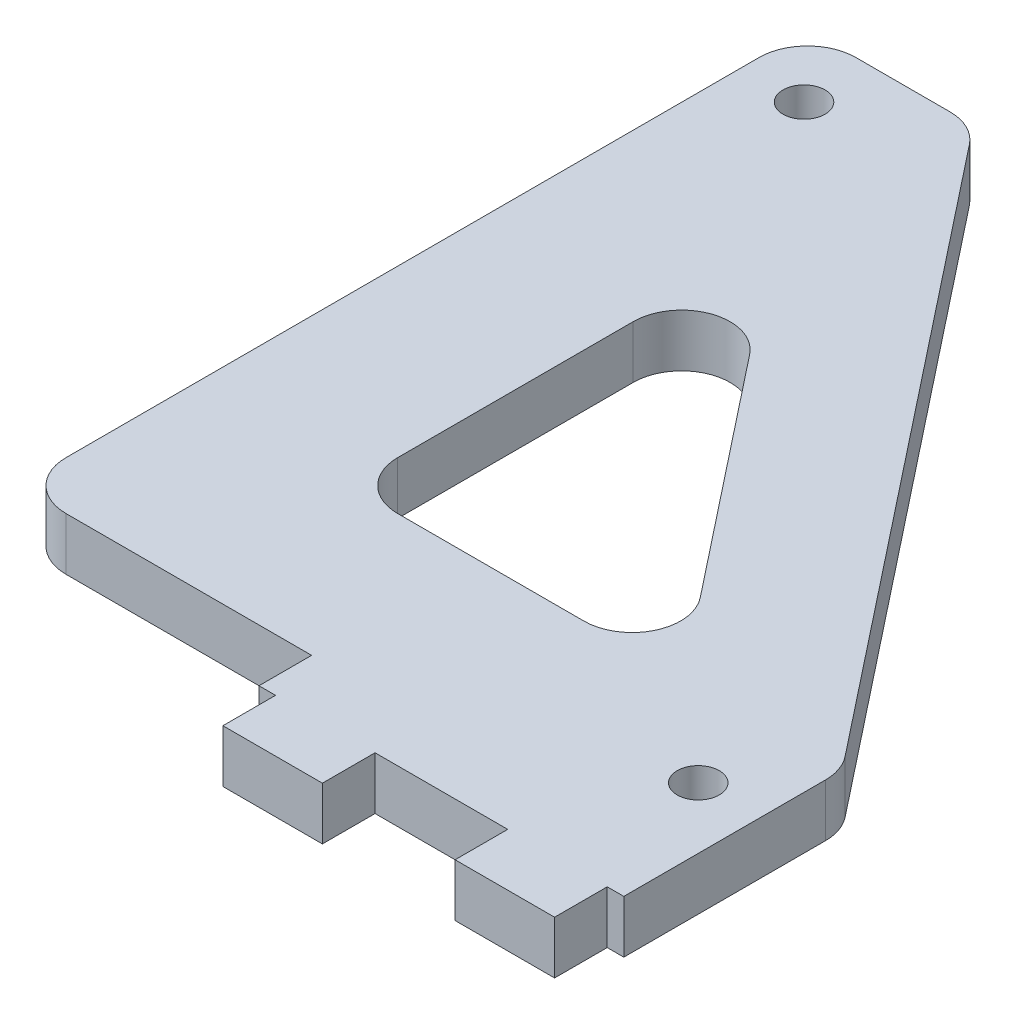
ISO-10303-21;
HEADER;
FILE_DESCRIPTION(('STEP AP214'),'2;1');
FILE_NAME('part.step','',(''),(''),'','','');
FILE_SCHEMA(('AUTOMOTIVE_DESIGN { 1 0 10303 214 1 1 1 1 }'));
ENDSEC;
DATA;
#1=APPLICATION_CONTEXT('core data for automotive mechanical design processes');
#2=APPLICATION_PROTOCOL_DEFINITION('international standard','automotive_design',2000,#1);
#3=PRODUCT_CONTEXT('',#1,'mechanical');
#4=PRODUCT('Part','Part','',(#3));
#5=PRODUCT_RELATED_PRODUCT_CATEGORY('part','',(#4));
#6=PRODUCT_DEFINITION_FORMATION('','',#4);
#7=PRODUCT_DEFINITION_CONTEXT('part definition',#1,'design');
#8=PRODUCT_DEFINITION('design','',#6,#7);
#9=PRODUCT_DEFINITION_SHAPE('','',#8);
#10=(LENGTH_UNIT() NAMED_UNIT(*) SI_UNIT(.MILLI.,.METRE.));
#11=(NAMED_UNIT(*) PLANE_ANGLE_UNIT() SI_UNIT($,.RADIAN.));
#12=(NAMED_UNIT(*) SI_UNIT($,.STERADIAN.) SOLID_ANGLE_UNIT());
#13=UNCERTAINTY_MEASURE_WITH_UNIT(LENGTH_MEASURE(1.E-05),#10,'distance_accuracy_value','');
#14=(GEOMETRIC_REPRESENTATION_CONTEXT(3) GLOBAL_UNCERTAINTY_ASSIGNED_CONTEXT((#13)) GLOBAL_UNIT_ASSIGNED_CONTEXT((#10,
#11,#12)) REPRESENTATION_CONTEXT('',''));
#15=CARTESIAN_POINT('',(0.,0.,0.));
#16=DIRECTION('',(0.,0.,1.));
#17=DIRECTION('',(1.,0.,0.));
#18=AXIS2_PLACEMENT_3D('',#15,#16,#17);
#19=CARTESIAN_POINT('',(0.,0.,3.175));
#20=DIRECTION('',(0.,0.,1.));
#21=DIRECTION('',(1.,0.,0.));
#22=AXIS2_PLACEMENT_3D('',#19,#20,#21);
#23=PLANE('',#22);
#24=DIRECTION('',(1.,0.,0.));
#25=VECTOR('',#24,1.);
#26=CARTESIAN_POINT('',(17.73,0.,3.175));
#27=LINE('',#26,#25);
#28=CARTESIAN_POINT('',(24.73,0.,3.175));
#29=VERTEX_POINT('',#28);
#30=CARTESIAN_POINT('',(32.73,0.,3.175));
#31=VERTEX_POINT('',#30);
#32=EDGE_CURVE('E223',#29,#31,#27,.T.);
#33=ORIENTED_EDGE('',*,*,#32,.T.);
#34=DIRECTION('',(0.,-1.,0.));
#35=VECTOR('',#34,1.);
#36=CARTESIAN_POINT('',(32.73,3.175,3.175));
#37=LINE('',#36,#35);
#38=CARTESIAN_POINT('',(32.73,3.175,3.175));
#39=VERTEX_POINT('',#38);
#40=EDGE_CURVE('E221',#39,#31,#37,.T.);
#41=ORIENTED_EDGE('',*,*,#40,.F.);
#42=DIRECTION('',(-1.,0.,0.));
#43=VECTOR('',#42,1.);
#44=CARTESIAN_POINT('',(17.73,3.175,3.175));
#45=LINE('',#44,#43);
#46=CARTESIAN_POINT('',(24.73,3.175,3.175));
#47=VERTEX_POINT('',#46);
#48=EDGE_CURVE('E204',#39,#47,#45,.T.);
#49=ORIENTED_EDGE('',*,*,#48,.T.);
#50=DIRECTION('',(0.,1.,0.));
#51=VECTOR('',#50,1.);
#52=CARTESIAN_POINT('',(24.73,3.175,3.175));
#53=LINE('',#52,#51);
#54=EDGE_CURVE('E251',#29,#47,#53,.T.);
#55=ORIENTED_EDGE('',*,*,#54,.F.);
#56=EDGE_LOOP('',(#33,#41,#49,#55));
#57=FACE_BOUND('',#56,.T.);
#58=ADVANCED_FACE('F39',(#57),#23,.T.);
#59=CARTESIAN_POINT('',(39.73,3.175,3.175));
#60=VERTEX_POINT('',#59);
#61=CARTESIAN_POINT('',(38.73,3.175,3.175));
#62=VERTEX_POINT('',#61);
#63=EDGE_CURVE('E54',#60,#62,#45,.T.);
#64=ORIENTED_EDGE('',*,*,#63,.T.);
#65=DIRECTION('',(0.,1.,0.));
#66=VECTOR('',#65,1.);
#67=CARTESIAN_POINT('',(38.73,3.175,3.175));
#68=LINE('',#67,#66);
#69=CARTESIAN_POINT('',(38.73,0.,3.175));
#70=VERTEX_POINT('',#69);
#71=EDGE_CURVE('E58',#70,#62,#68,.T.);
#72=ORIENTED_EDGE('',*,*,#71,.F.);
#73=CARTESIAN_POINT('',(39.73,0.,3.175));
#74=VERTEX_POINT('',#73);
#75=EDGE_CURVE('E274',#70,#74,#27,.T.);
#76=ORIENTED_EDGE('',*,*,#75,.T.);
#77=DIRECTION('',(0.,1.,0.));
#78=VECTOR('',#77,1.);
#79=CARTESIAN_POINT('',(39.73,3.175,3.175));
#80=LINE('',#79,#78);
#81=EDGE_CURVE('E277',#74,#60,#80,.T.);
#82=ORIENTED_EDGE('',*,*,#81,.T.);
#83=EDGE_LOOP('',(#64,#72,#76,#82));
#84=FACE_BOUND('',#83,.T.);
#85=ADVANCED_FACE('F445',(#84),#23,.T.);
#86=DIRECTION('',(0.,-1.,0.));
#87=VECTOR('',#86,1.);
#88=CARTESIAN_POINT('',(18.73,3.175,3.175));
#89=LINE('',#88,#87);
#90=CARTESIAN_POINT('',(18.73,3.175,3.175));
#91=VERTEX_POINT('',#90);
#92=CARTESIAN_POINT('',(18.73,0.,3.175));
#93=VERTEX_POINT('',#92);
#94=EDGE_CURVE('E227',#91,#93,#89,.T.);
#95=ORIENTED_EDGE('',*,*,#94,.F.);
#96=CARTESIAN_POINT('',(17.73,3.175,3.175));
#97=VERTEX_POINT('',#96);
#98=EDGE_CURVE('E218',#91,#97,#45,.T.);
#99=ORIENTED_EDGE('',*,*,#98,.T.);
#100=DIRECTION('',(0.,-1.,0.));
#101=VECTOR('',#100,1.);
#102=CARTESIAN_POINT('',(17.73,3.175,3.175));
#103=LINE('',#102,#101);
#104=CARTESIAN_POINT('',(17.73,0.,3.175));
#105=VERTEX_POINT('',#104);
#106=EDGE_CURVE('E271',#97,#105,#103,.T.);
#107=ORIENTED_EDGE('',*,*,#106,.T.);
#108=EDGE_CURVE('E275',#105,#93,#27,.T.);
#109=ORIENTED_EDGE('',*,*,#108,.T.);
#110=EDGE_LOOP('',(#95,#99,#107,#109));
#111=FACE_BOUND('',#110,.T.);
#112=ADVANCED_FACE('F447',(#111),#23,.T.);
#113=CARTESIAN_POINT('',(39.73,3.175,0.));
#114=DIRECTION('',(0.,0.,-1.));
#115=DIRECTION('',(-1.,0.,0.));
#116=AXIS2_PLACEMENT_3D('',#113,#114,#115);
#117=PLANE('',#116);
#118=DIRECTION('',(0.,-1.,0.));
#119=VECTOR('',#118,1.);
#120=CARTESIAN_POINT('',(17.73,3.175,0.));
#121=LINE('',#120,#119);
#122=CARTESIAN_POINT('',(17.73,3.175,0.));
#123=VERTEX_POINT('',#122);
#124=CARTESIAN_POINT('',(17.73,0.,0.));
#125=VERTEX_POINT('',#124);
#126=EDGE_CURVE('E270',#123,#125,#121,.T.);
#127=ORIENTED_EDGE('',*,*,#126,.F.);
#128=DIRECTION('',(1.,0.,0.));
#129=VECTOR('',#128,1.);
#130=CARTESIAN_POINT('',(39.73,3.175,0.));
#131=LINE('',#130,#129);
#132=CARTESIAN_POINT('',(2.921,3.175,0.));
#133=VERTEX_POINT('',#132);
#134=EDGE_CURVE('E316',#133,#123,#131,.T.);
#135=ORIENTED_EDGE('',*,*,#134,.F.);
#136=DIRECTION('',(0.,-1.,0.));
#137=VECTOR('',#136,1.);
#138=CARTESIAN_POINT('',(2.921,3.175,0.));
#139=LINE('',#138,#137);
#140=CARTESIAN_POINT('',(2.921,0.,0.));
#141=VERTEX_POINT('',#140);
#142=EDGE_CURVE('E392',#133,#141,#139,.T.);
#143=ORIENTED_EDGE('',*,*,#142,.T.);
#144=DIRECTION('',(1.,0.,0.));
#145=VECTOR('',#144,1.);
#146=CARTESIAN_POINT('',(39.73,0.,0.));
#147=LINE('',#146,#145);
#148=EDGE_CURVE('E308',#141,#125,#147,.T.);
#149=ORIENTED_EDGE('',*,*,#148,.T.);
#150=EDGE_LOOP('',(#127,#135,#143,#149));
#151=FACE_BOUND('',#150,.T.);
#152=ADVANCED_FACE('F454',(#151),#117,.F.);
#153=CARTESIAN_POINT('',(0.,3.175,0.));
#154=DIRECTION('',(0.,-1.,0.));
#155=DIRECTION('',(0.,0.,-1.));
#156=AXIS2_PLACEMENT_3D('',#153,#154,#155);
#157=PLANE('',#156);
#158=DIRECTION('',(-0.619928204493088,0.,-0.784658538011265));
#159=VECTOR('',#158,1.);
#160=CARTESIAN_POINT('',(10.,3.175,-47.63));
#161=LINE('',#160,#159);
#162=CARTESIAN_POINT('',(39.1009875895309,3.175,-10.7961566433216));
#163=VERTEX_POINT('',#162);
#164=CARTESIAN_POINT('',(10.8771177309941,3.175,-46.5198102853243));
#165=VERTEX_POINT('',#164);
#166=EDGE_CURVE('E323',#163,#165,#161,.T.);
#167=ORIENTED_EDGE('',*,*,#166,.T.);
#168=CARTESIAN_POINT('',(8.5851301414632,3.175,-44.709));
#169=DIRECTION('',(0.,-1.,0.));
#170=DIRECTION('',(0.,0.,-1.));
#171=AXIS2_PLACEMENT_3D('',#168,#169,#170);
#172=CIRCLE('',#171,2.921);
#173=CARTESIAN_POINT('',(8.5851301414632,3.175,-47.63));
#174=VERTEX_POINT('',#173);
#175=EDGE_CURVE('E368',#165,#174,#172,.F.);
#176=ORIENTED_EDGE('',*,*,#175,.T.);
#177=DIRECTION('',(-1.,0.,0.));
#178=VECTOR('',#177,1.);
#179=CARTESIAN_POINT('',(0.,3.175,-47.63));
#180=LINE('',#179,#178);
#181=CARTESIAN_POINT('',(2.921,3.175,-47.63));
#182=VERTEX_POINT('',#181);
#183=EDGE_CURVE('E325',#174,#182,#180,.T.);
#184=ORIENTED_EDGE('',*,*,#183,.T.);
#185=CARTESIAN_POINT('',(2.921,3.175,-44.709));
#186=DIRECTION('',(0.,-1.,0.));
#187=DIRECTION('',(0.,0.,-1.));
#188=AXIS2_PLACEMENT_3D('',#185,#186,#187);
#189=CIRCLE('',#188,2.921);
#190=CARTESIAN_POINT('',(0.,3.175,-44.709));
#191=VERTEX_POINT('',#190);
#192=EDGE_CURVE('E364',#182,#191,#189,.F.);
#193=ORIENTED_EDGE('',*,*,#192,.T.);
#194=DIRECTION('',(0.,0.,1.));
#195=VECTOR('',#194,1.);
#196=CARTESIAN_POINT('',(0.,3.175,0.));
#197=LINE('',#196,#195);
#198=CARTESIAN_POINT('',(0.,3.175,-2.921));
#199=VERTEX_POINT('',#198);
#200=EDGE_CURVE('E328',#191,#199,#197,.T.);
#201=ORIENTED_EDGE('',*,*,#200,.T.);
#202=CARTESIAN_POINT('',(2.921,3.175,-2.921));
#203=DIRECTION('',(0.,-1.,0.));
#204=DIRECTION('',(0.,0.,-1.));
#205=AXIS2_PLACEMENT_3D('',#202,#203,#204);
#206=CIRCLE('',#205,2.921);
#207=EDGE_CURVE('E362',#199,#133,#206,.F.);
#208=ORIENTED_EDGE('',*,*,#207,.T.);
#209=ORIENTED_EDGE('',*,*,#134,.T.);
#210=DIRECTION('',(0.,0.,-1.));
#211=VECTOR('',#210,1.);
#212=CARTESIAN_POINT('',(17.73,3.175,3.175));
#213=LINE('',#212,#211);
#214=EDGE_CURVE('E279',#97,#123,#213,.T.);
#215=ORIENTED_EDGE('',*,*,#214,.F.);
#216=ORIENTED_EDGE('',*,*,#98,.F.);
#217=DIRECTION('',(0.,0.,-1.));
#218=VECTOR('',#217,1.);
#219=CARTESIAN_POINT('',(18.73,3.175,6.35));
#220=LINE('',#219,#218);
#221=CARTESIAN_POINT('',(18.73,3.175,6.35));
#222=VERTEX_POINT('',#221);
#223=EDGE_CURVE('E257',#222,#91,#220,.T.);
#224=ORIENTED_EDGE('',*,*,#223,.F.);
#225=DIRECTION('',(-1.,0.,0.));
#226=VECTOR('',#225,1.);
#227=CARTESIAN_POINT('',(18.73,3.175,6.35));
#228=LINE('',#227,#226);
#229=CARTESIAN_POINT('',(24.73,3.175,6.35));
#230=VERTEX_POINT('',#229);
#231=EDGE_CURVE('E255',#230,#222,#228,.T.);
#232=ORIENTED_EDGE('',*,*,#231,.F.);
#233=DIRECTION('',(0.,0.,-1.));
#234=VECTOR('',#233,1.);
#235=CARTESIAN_POINT('',(24.73,3.175,6.35));
#236=LINE('',#235,#234);
#237=EDGE_CURVE('E215',#230,#47,#236,.T.);
#238=ORIENTED_EDGE('',*,*,#237,.T.);
#239=ORIENTED_EDGE('',*,*,#48,.F.);
#240=DIRECTION('',(0.,0.,-1.));
#241=VECTOR('',#240,1.);
#242=CARTESIAN_POINT('',(32.73,3.175,6.35));
#243=LINE('',#242,#241);
#244=CARTESIAN_POINT('',(32.73,3.175,6.35));
#245=VERTEX_POINT('',#244);
#246=EDGE_CURVE('E211',#245,#39,#243,.T.);
#247=ORIENTED_EDGE('',*,*,#246,.F.);
#248=DIRECTION('',(-1.,0.,0.));
#249=VECTOR('',#248,1.);
#250=CARTESIAN_POINT('',(32.73,3.175,6.35));
#251=LINE('',#250,#249);
#252=CARTESIAN_POINT('',(38.73,3.175,6.35));
#253=VERTEX_POINT('',#252);
#254=EDGE_CURVE('E232',#253,#245,#251,.T.);
#255=ORIENTED_EDGE('',*,*,#254,.F.);
#256=DIRECTION('',(0.,0.,-1.));
#257=VECTOR('',#256,1.);
#258=CARTESIAN_POINT('',(38.73,3.175,6.35));
#259=LINE('',#258,#257);
#260=EDGE_CURVE('E233',#253,#62,#259,.T.);
#261=ORIENTED_EDGE('',*,*,#260,.T.);
#262=ORIENTED_EDGE('',*,*,#63,.F.);
#263=DIRECTION('',(0.,0.,-1.));
#264=VECTOR('',#263,1.);
#265=CARTESIAN_POINT('',(39.73,3.175,-10.));
#266=LINE('',#265,#264);
#267=CARTESIAN_POINT('',(39.73,3.175,-8.98534635799732));
#268=VERTEX_POINT('',#267);
#269=EDGE_CURVE('E319',#60,#268,#266,.T.);
#270=ORIENTED_EDGE('',*,*,#269,.T.);
#271=CARTESIAN_POINT('',(36.809,3.175,-8.98534635799732));
#272=DIRECTION('',(0.,-1.,0.));
#273=DIRECTION('',(0.,0.,-1.));
#274=AXIS2_PLACEMENT_3D('',#271,#272,#273);
#275=CIRCLE('',#274,2.921);
#276=EDGE_CURVE('E366',#268,#163,#275,.F.);
#277=ORIENTED_EDGE('',*,*,#276,.T.);
#278=EDGE_LOOP('',(#167,#176,#184,#193,#201,#208,#209,#215,#216,#224,#232,#238,#239,#247,#255,
#261,#262,#270,#277));
#279=FACE_BOUND('',#278,.T.);
#280=DIRECTION('',(1.,0.,0.));
#281=VECTOR('',#280,1.);
#282=CARTESIAN_POINT('',(10.,3.175,-10.));
#283=LINE('',#282,#281);
#284=CARTESIAN_POINT('',(12.921,3.175,-10.));
#285=VERTEX_POINT('',#284);
#286=CARTESIAN_POINT('',(24.1412952414612,3.175,-10.));
#287=VERTEX_POINT('',#286);
#288=EDGE_CURVE('E298',#285,#287,#283,.T.);
#289=ORIENTED_EDGE('',*,*,#288,.F.);
#290=CARTESIAN_POINT('',(12.921,3.175,-12.921));
#291=DIRECTION('',(0.,-1.,0.));
#292=DIRECTION('',(0.,0.,-1.));
#293=AXIS2_PLACEMENT_3D('',#290,#291,#292);
#294=CIRCLE('',#293,2.921);
#295=CARTESIAN_POINT('',(10.,3.175,-12.921));
#296=VERTEX_POINT('',#295);
#297=EDGE_CURVE('E11',#285,#296,#294,.T.);
#298=ORIENTED_EDGE('',*,*,#297,.T.);
#299=DIRECTION('',(0.,0.,1.));
#300=VECTOR('',#299,1.);
#301=CARTESIAN_POINT('',(10.,3.175,-35.5318248473907));
#302=LINE('',#301,#300);
#303=CARTESIAN_POINT('',(10.,3.175,-27.1228065905208));
#304=VERTEX_POINT('',#303);
#305=EDGE_CURVE('E305',#304,#296,#302,.T.);
#306=ORIENTED_EDGE('',*,*,#305,.F.);
#307=CARTESIAN_POINT('',(12.921,3.175,-27.1228065905208));
#308=DIRECTION('',(0.,-1.,0.));
#309=DIRECTION('',(0.,0.,-1.));
#310=AXIS2_PLACEMENT_3D('',#307,#308,#309);
#311=CIRCLE('',#310,2.921);
#312=CARTESIAN_POINT('',(15.2129875895309,3.175,-28.9336168758451));
#313=VERTEX_POINT('',#312);
#314=EDGE_CURVE('E397',#304,#313,#311,.T.);
#315=ORIENTED_EDGE('',*,*,#314,.T.);
#316=DIRECTION('',(-0.619928204493088,0.,-0.784658538011265));
#317=VECTOR('',#316,1.);
#318=CARTESIAN_POINT('',(10.,3.175,-35.5318248473907));
#319=LINE('',#318,#317);
#320=CARTESIAN_POINT('',(26.4332828309921,3.175,-14.7318102853243));
#321=VERTEX_POINT('',#320);
#322=EDGE_CURVE('E301',#321,#313,#319,.T.);
#323=ORIENTED_EDGE('',*,*,#322,.F.);
#324=CARTESIAN_POINT('',(24.1412952414612,3.175,-12.921));
#325=DIRECTION('',(0.,-1.,0.));
#326=DIRECTION('',(0.,0.,-1.));
#327=AXIS2_PLACEMENT_3D('',#324,#325,#326);
#328=CIRCLE('',#327,2.921);
#329=EDGE_CURVE('E401',#321,#287,#328,.T.);
#330=ORIENTED_EDGE('',*,*,#329,.T.);
#331=EDGE_LOOP('',(#289,#298,#306,#315,#323,#330));
#332=FACE_BOUND('',#331,.T.);
#333=CARTESIAN_POINT('',(3.68299999999999,3.175,-43.74));
#334=DIRECTION('',(0.,1.,0.));
#335=DIRECTION('',(0.,0.,1.));
#336=AXIS2_PLACEMENT_3D('',#333,#334,#335);
#337=CIRCLE('',#336,1.27);
#338=CARTESIAN_POINT('',(3.68299999999999,3.175,-42.47));
#339=VERTEX_POINT('',#338);
#340=EDGE_CURVE('E292',#339,#339,#337,.T.);
#341=ORIENTED_EDGE('',*,*,#340,.F.);
#342=EDGE_LOOP('',(#341));
#343=FACE_BOUND('',#342,.T.);
#344=CARTESIAN_POINT('',(36.043,3.175,-5.));
#345=DIRECTION('',(0.,1.,0.));
#346=DIRECTION('',(0.,0.,1.));
#347=AXIS2_PLACEMENT_3D('',#344,#345,#346);
#348=CIRCLE('',#347,1.27);
#349=CARTESIAN_POINT('',(36.043,3.175,-3.73));
#350=VERTEX_POINT('',#349);
#351=EDGE_CURVE('E286',#350,#350,#348,.T.);
#352=ORIENTED_EDGE('',*,*,#351,.F.);
#353=EDGE_LOOP('',(#352));
#354=FACE_BOUND('',#353,.T.);
#355=ADVANCED_FACE('F207',(#279,#332,#343,#354),#157,.F.);
#356=CARTESIAN_POINT('',(0.,0.,0.));
#357=DIRECTION('',(0.,-1.,0.));
#358=DIRECTION('',(0.,0.,-1.));
#359=AXIS2_PLACEMENT_3D('',#356,#357,#358);
#360=PLANE('',#359);
#361=CARTESIAN_POINT('',(3.68299999999999,0.,-43.74));
#362=DIRECTION('',(0.,1.,0.));
#363=DIRECTION('',(0.,0.,1.));
#364=AXIS2_PLACEMENT_3D('',#361,#362,#363);
#365=CIRCLE('',#364,1.27);
#366=CARTESIAN_POINT('',(3.68299999999999,0.,-42.47));
#367=VERTEX_POINT('',#366);
#368=EDGE_CURVE('E289',#367,#367,#365,.T.);
#369=ORIENTED_EDGE('',*,*,#368,.T.);
#370=EDGE_LOOP('',(#369));
#371=FACE_BOUND('',#370,.T.);
#372=DIRECTION('',(-1.,0.,0.));
#373=VECTOR('',#372,1.);
#374=CARTESIAN_POINT('',(0.,0.,-47.63));
#375=LINE('',#374,#373);
#376=CARTESIAN_POINT('',(8.5851301414632,0.,-47.63));
#377=VERTEX_POINT('',#376);
#378=CARTESIAN_POINT('',(2.921,0.,-47.63));
#379=VERTEX_POINT('',#378);
#380=EDGE_CURVE('E340',#377,#379,#375,.T.);
#381=ORIENTED_EDGE('',*,*,#380,.F.);
#382=CARTESIAN_POINT('',(8.5851301414632,0.,-44.709));
#383=DIRECTION('',(0.,-1.,0.));
#384=DIRECTION('',(0.,0.,-1.));
#385=AXIS2_PLACEMENT_3D('',#382,#383,#384);
#386=CIRCLE('',#385,2.921);
#387=CARTESIAN_POINT('',(10.8771177309941,0.,-46.5198102853243));
#388=VERTEX_POINT('',#387);
#389=EDGE_CURVE('E355',#377,#388,#386,.T.);
#390=ORIENTED_EDGE('',*,*,#389,.T.);
#391=DIRECTION('',(-0.619928204493088,0.,-0.784658538011265));
#392=VECTOR('',#391,1.);
#393=CARTESIAN_POINT('',(10.,0.,-47.63));
#394=LINE('',#393,#392);
#395=CARTESIAN_POINT('',(39.1009875895309,0.,-10.7961566433216));
#396=VERTEX_POINT('',#395);
#397=EDGE_CURVE('E337',#396,#388,#394,.T.);
#398=ORIENTED_EDGE('',*,*,#397,.F.);
#399=CARTESIAN_POINT('',(36.809,0.,-8.98534635799732));
#400=DIRECTION('',(0.,-1.,0.));
#401=DIRECTION('',(0.,0.,-1.));
#402=AXIS2_PLACEMENT_3D('',#399,#400,#401);
#403=CIRCLE('',#402,2.921);
#404=CARTESIAN_POINT('',(39.73,0.,-8.98534635799732));
#405=VERTEX_POINT('',#404);
#406=EDGE_CURVE('E353',#396,#405,#403,.T.);
#407=ORIENTED_EDGE('',*,*,#406,.T.);
#408=DIRECTION('',(0.,0.,-1.));
#409=VECTOR('',#408,1.);
#410=CARTESIAN_POINT('',(39.73,0.,-10.));
#411=LINE('',#410,#409);
#412=EDGE_CURVE('E334',#74,#405,#411,.T.);
#413=ORIENTED_EDGE('',*,*,#412,.F.);
#414=ORIENTED_EDGE('',*,*,#75,.F.);
#415=DIRECTION('',(0.,0.,-1.));
#416=VECTOR('',#415,1.);
#417=CARTESIAN_POINT('',(38.73,0.,6.35));
#418=LINE('',#417,#416);
#419=CARTESIAN_POINT('',(38.73,0.,6.35));
#420=VERTEX_POINT('',#419);
#421=EDGE_CURVE('E238',#420,#70,#418,.T.);
#422=ORIENTED_EDGE('',*,*,#421,.F.);
#423=DIRECTION('',(1.,0.,0.));
#424=VECTOR('',#423,1.);
#425=CARTESIAN_POINT('',(32.73,0.,6.35));
#426=LINE('',#425,#424);
#427=CARTESIAN_POINT('',(32.73,0.,6.35));
#428=VERTEX_POINT('',#427);
#429=EDGE_CURVE('E244',#428,#420,#426,.T.);
#430=ORIENTED_EDGE('',*,*,#429,.F.);
#431=DIRECTION('',(0.,0.,-1.));
#432=VECTOR('',#431,1.);
#433=CARTESIAN_POINT('',(32.73,0.,6.35));
#434=LINE('',#433,#432);
#435=EDGE_CURVE('E477',#428,#31,#434,.T.);
#436=ORIENTED_EDGE('',*,*,#435,.T.);
#437=ORIENTED_EDGE('',*,*,#32,.F.);
#438=DIRECTION('',(0.,0.,-1.));
#439=VECTOR('',#438,1.);
#440=CARTESIAN_POINT('',(24.73,0.,6.35));
#441=LINE('',#440,#439);
#442=CARTESIAN_POINT('',(24.73,0.,6.35));
#443=VERTEX_POINT('',#442);
#444=EDGE_CURVE('E264',#443,#29,#441,.T.);
#445=ORIENTED_EDGE('',*,*,#444,.F.);
#446=DIRECTION('',(1.,0.,0.));
#447=VECTOR('',#446,1.);
#448=CARTESIAN_POINT('',(18.73,0.,6.35));
#449=LINE('',#448,#447);
#450=CARTESIAN_POINT('',(18.73,0.,6.35));
#451=VERTEX_POINT('',#450);
#452=EDGE_CURVE('E250',#451,#443,#449,.T.);
#453=ORIENTED_EDGE('',*,*,#452,.F.);
#454=DIRECTION('',(0.,0.,-1.));
#455=VECTOR('',#454,1.);
#456=CARTESIAN_POINT('',(18.73,0.,6.35));
#457=LINE('',#456,#455);
#458=EDGE_CURVE('E267',#451,#93,#457,.T.);
#459=ORIENTED_EDGE('',*,*,#458,.T.);
#460=ORIENTED_EDGE('',*,*,#108,.F.);
#461=DIRECTION('',(0.,0.,-1.));
#462=VECTOR('',#461,1.);
#463=CARTESIAN_POINT('',(17.73,0.,3.175));
#464=LINE('',#463,#462);
#465=EDGE_CURVE('E283',#105,#125,#464,.T.);
#466=ORIENTED_EDGE('',*,*,#465,.T.);
#467=ORIENTED_EDGE('',*,*,#148,.F.);
#468=CARTESIAN_POINT('',(2.921,0.,-2.921));
#469=DIRECTION('',(0.,-1.,0.));
#470=DIRECTION('',(0.,0.,-1.));
#471=AXIS2_PLACEMENT_3D('',#468,#469,#470);
#472=CIRCLE('',#471,2.921);
#473=CARTESIAN_POINT('',(0.,0.,-2.921));
#474=VERTEX_POINT('',#473);
#475=EDGE_CURVE('E349',#141,#474,#472,.T.);
#476=ORIENTED_EDGE('',*,*,#475,.T.);
#477=DIRECTION('',(0.,0.,1.));
#478=VECTOR('',#477,1.);
#479=CARTESIAN_POINT('',(0.,0.,0.));
#480=LINE('',#479,#478);
#481=CARTESIAN_POINT('',(0.,0.,-44.709));
#482=VERTEX_POINT('',#481);
#483=EDGE_CURVE('E320',#482,#474,#480,.T.);
#484=ORIENTED_EDGE('',*,*,#483,.F.);
#485=CARTESIAN_POINT('',(2.921,0.,-44.709));
#486=DIRECTION('',(0.,-1.,0.));
#487=DIRECTION('',(0.,0.,-1.));
#488=AXIS2_PLACEMENT_3D('',#485,#486,#487);
#489=CIRCLE('',#488,2.921);
#490=EDGE_CURVE('E351',#482,#379,#489,.T.);
#491=ORIENTED_EDGE('',*,*,#490,.T.);
#492=EDGE_LOOP('',(#381,#390,#398,#407,#413,#414,#422,#430,#436,#437,#445,#453,#459,#460,#466,
#467,#476,#484,#491));
#493=FACE_BOUND('',#492,.T.);
#494=DIRECTION('',(-0.619928204493088,0.,-0.784658538011265));
#495=VECTOR('',#494,1.);
#496=CARTESIAN_POINT('',(10.,0.,-35.5318248473907));
#497=LINE('',#496,#495);
#498=CARTESIAN_POINT('',(26.4332828309921,0.,-14.7318102853243));
#499=VERTEX_POINT('',#498);
#500=CARTESIAN_POINT('',(15.2129875895309,0.,-28.9336168758451));
#501=VERTEX_POINT('',#500);
#502=EDGE_CURVE('E311',#499,#501,#497,.T.);
#503=ORIENTED_EDGE('',*,*,#502,.T.);
#504=CARTESIAN_POINT('',(12.921,0.,-27.1228065905208));
#505=DIRECTION('',(0.,-1.,0.));
#506=DIRECTION('',(0.,0.,-1.));
#507=AXIS2_PLACEMENT_3D('',#504,#505,#506);
#508=CIRCLE('',#507,2.921);
#509=CARTESIAN_POINT('',(10.,0.,-27.1228065905208));
#510=VERTEX_POINT('',#509);
#511=EDGE_CURVE('E395',#501,#510,#508,.F.);
#512=ORIENTED_EDGE('',*,*,#511,.T.);
#513=DIRECTION('',(0.,0.,1.));
#514=VECTOR('',#513,1.);
#515=CARTESIAN_POINT('',(10.,0.,-35.5318248473907));
#516=LINE('',#515,#514);
#517=CARTESIAN_POINT('',(10.,0.,-12.921));
#518=VERTEX_POINT('',#517);
#519=EDGE_CURVE('E302',#510,#518,#516,.T.);
#520=ORIENTED_EDGE('',*,*,#519,.T.);
#521=CARTESIAN_POINT('',(12.921,0.,-12.921));
#522=DIRECTION('',(0.,-1.,0.));
#523=DIRECTION('',(0.,0.,-1.));
#524=AXIS2_PLACEMENT_3D('',#521,#522,#523);
#525=CIRCLE('',#524,2.921);
#526=CARTESIAN_POINT('',(12.921,0.,-10.));
#527=VERTEX_POINT('',#526);
#528=EDGE_CURVE('E47',#518,#527,#525,.F.);
#529=ORIENTED_EDGE('',*,*,#528,.T.);
#530=DIRECTION('',(1.,0.,0.));
#531=VECTOR('',#530,1.);
#532=CARTESIAN_POINT('',(10.,0.,-10.));
#533=LINE('',#532,#531);
#534=CARTESIAN_POINT('',(24.1412952414612,0.,-10.));
#535=VERTEX_POINT('',#534);
#536=EDGE_CURVE('E295',#527,#535,#533,.T.);
#537=ORIENTED_EDGE('',*,*,#536,.T.);
#538=CARTESIAN_POINT('',(24.1412952414612,0.,-12.921));
#539=DIRECTION('',(0.,-1.,0.));
#540=DIRECTION('',(0.,0.,-1.));
#541=AXIS2_PLACEMENT_3D('',#538,#539,#540);
#542=CIRCLE('',#541,2.921);
#543=EDGE_CURVE('E399',#535,#499,#542,.F.);
#544=ORIENTED_EDGE('',*,*,#543,.T.);
#545=EDGE_LOOP('',(#503,#512,#520,#529,#537,#544));
#546=FACE_BOUND('',#545,.T.);
#547=CARTESIAN_POINT('',(36.043,0.,-5.));
#548=DIRECTION('',(0.,1.,0.));
#549=DIRECTION('',(0.,0.,1.));
#550=AXIS2_PLACEMENT_3D('',#547,#548,#549);
#551=CIRCLE('',#550,1.27);
#552=CARTESIAN_POINT('',(36.043,0.,-3.73));
#553=VERTEX_POINT('',#552);
#554=EDGE_CURVE('E285',#553,#553,#551,.T.);
#555=ORIENTED_EDGE('',*,*,#554,.T.);
#556=EDGE_LOOP('',(#555));
#557=FACE_BOUND('',#556,.T.);
#558=ADVANCED_FACE('F404',(#371,#493,#546,#557),#360,.T.);
#559=CARTESIAN_POINT('',(39.73,3.175,-10.));
#560=DIRECTION('',(-1.,0.,0.));
#561=DIRECTION('',(0.,0.,1.));
#562=AXIS2_PLACEMENT_3D('',#559,#560,#561);
#563=PLANE('',#562);
#564=ORIENTED_EDGE('',*,*,#412,.T.);
#565=DIRECTION('',(0.,-1.,0.));
#566=VECTOR('',#565,1.);
#567=CARTESIAN_POINT('',(39.73,3.175,-8.98534635799732));
#568=LINE('',#567,#566);
#569=EDGE_CURVE('E370',#405,#268,#568,.F.);
#570=ORIENTED_EDGE('',*,*,#569,.T.);
#571=ORIENTED_EDGE('',*,*,#269,.F.);
#572=ORIENTED_EDGE('',*,*,#81,.F.);
#573=EDGE_LOOP('',(#564,#570,#571,#572));
#574=FACE_BOUND('',#573,.T.);
#575=ADVANCED_FACE('F485',(#574),#563,.F.);
#576=CARTESIAN_POINT('',(10.,3.175,-47.63));
#577=DIRECTION('',(-0.784658538011265,0.,0.619928204493088));
#578=DIRECTION('',(0.619928204493088,0.,0.784658538011265));
#579=AXIS2_PLACEMENT_3D('',#576,#577,#578);
#580=PLANE('',#579);
#581=ORIENTED_EDGE('',*,*,#397,.T.);
#582=DIRECTION('',(0.,-1.,0.));
#583=VECTOR('',#582,1.);
#584=CARTESIAN_POINT('',(10.8771177309941,3.175,-46.5198102853243));
#585=LINE('',#584,#583);
#586=EDGE_CURVE('E360',#388,#165,#585,.F.);
#587=ORIENTED_EDGE('',*,*,#586,.T.);
#588=ORIENTED_EDGE('',*,*,#166,.F.);
#589=DIRECTION('',(0.,-1.,0.));
#590=VECTOR('',#589,1.);
#591=CARTESIAN_POINT('',(39.1009875895309,3.175,-10.7961566433216));
#592=LINE('',#591,#590);
#593=EDGE_CURVE('E357',#163,#396,#592,.T.);
#594=ORIENTED_EDGE('',*,*,#593,.T.);
#595=EDGE_LOOP('',(#581,#587,#588,#594));
#596=FACE_BOUND('',#595,.T.);
#597=ADVANCED_FACE('F491',(#596),#580,.F.);
#598=CARTESIAN_POINT('',(0.,3.175,-47.63));
#599=DIRECTION('',(0.,0.,1.));
#600=DIRECTION('',(1.,0.,0.));
#601=AXIS2_PLACEMENT_3D('',#598,#599,#600);
#602=PLANE('',#601);
#603=ORIENTED_EDGE('',*,*,#183,.F.);
#604=DIRECTION('',(0.,-1.,0.));
#605=VECTOR('',#604,1.);
#606=CARTESIAN_POINT('',(8.5851301414632,3.175,-47.63));
#607=LINE('',#606,#605);
#608=EDGE_CURVE('E346',#174,#377,#607,.T.);
#609=ORIENTED_EDGE('',*,*,#608,.T.);
#610=ORIENTED_EDGE('',*,*,#380,.T.);
#611=DIRECTION('',(0.,-1.,0.));
#612=VECTOR('',#611,1.);
#613=CARTESIAN_POINT('',(2.921,3.175,-47.63));
#614=LINE('',#613,#612);
#615=EDGE_CURVE('E331',#379,#182,#614,.F.);
#616=ORIENTED_EDGE('',*,*,#615,.T.);
#617=EDGE_LOOP('',(#603,#609,#610,#616));
#618=FACE_BOUND('',#617,.T.);
#619=ADVANCED_FACE('F499',(#618),#602,.F.);
#620=CARTESIAN_POINT('',(0.,3.175,0.));
#621=DIRECTION('',(1.,0.,0.));
#622=DIRECTION('',(0.,0.,-1.));
#623=AXIS2_PLACEMENT_3D('',#620,#621,#622);
#624=PLANE('',#623);
#625=ORIENTED_EDGE('',*,*,#200,.F.);
#626=DIRECTION('',(0.,-1.,0.));
#627=VECTOR('',#626,1.);
#628=CARTESIAN_POINT('',(0.,3.175,-44.709));
#629=LINE('',#628,#627);
#630=EDGE_CURVE('E389',#191,#482,#629,.T.);
#631=ORIENTED_EDGE('',*,*,#630,.T.);
#632=ORIENTED_EDGE('',*,*,#483,.T.);
#633=DIRECTION('',(0.,-1.,0.));
#634=VECTOR('',#633,1.);
#635=CARTESIAN_POINT('',(0.,3.175,-2.921));
#636=LINE('',#635,#634);
#637=EDGE_CURVE('E387',#474,#199,#636,.F.);
#638=ORIENTED_EDGE('',*,*,#637,.T.);
#639=EDGE_LOOP('',(#625,#631,#632,#638));
#640=FACE_BOUND('',#639,.T.);
#641=ADVANCED_FACE('F506',(#640),#624,.F.);
#642=CARTESIAN_POINT('',(10.,3.175,-10.));
#643=DIRECTION('',(0.,0.,-1.));
#644=DIRECTION('',(-1.,0.,0.));
#645=AXIS2_PLACEMENT_3D('',#642,#643,#644);
#646=PLANE('',#645);
#647=ORIENTED_EDGE('',*,*,#288,.T.);
#648=DIRECTION('',(0.,-1.,0.));
#649=VECTOR('',#648,1.);
#650=CARTESIAN_POINT('',(24.1412952414612,0.,-10.));
#651=LINE('',#650,#649);
#652=EDGE_CURVE('E384',#287,#535,#651,.T.);
#653=ORIENTED_EDGE('',*,*,#652,.T.);
#654=ORIENTED_EDGE('',*,*,#536,.F.);
#655=DIRECTION('',(0.,-1.,0.));
#656=VECTOR('',#655,1.);
#657=CARTESIAN_POINT('',(12.921,3.175,-10.));
#658=LINE('',#657,#656);
#659=EDGE_CURVE('E382',#527,#285,#658,.F.);
#660=ORIENTED_EDGE('',*,*,#659,.T.);
#661=EDGE_LOOP('',(#647,#653,#654,#660));
#662=FACE_BOUND('',#661,.T.);
#663=ADVANCED_FACE('F411',(#662),#646,.T.);
#664=CARTESIAN_POINT('',(10.,3.175,-35.5318248473907));
#665=DIRECTION('',(-0.784658538011265,0.,0.619928204493088));
#666=DIRECTION('',(0.619928204493088,0.,0.784658538011265));
#667=AXIS2_PLACEMENT_3D('',#664,#665,#666);
#668=PLANE('',#667);
#669=ORIENTED_EDGE('',*,*,#322,.T.);
#670=DIRECTION('',(0.,-1.,0.));
#671=VECTOR('',#670,1.);
#672=CARTESIAN_POINT('',(15.2129875895309,0.,-28.9336168758452));
#673=LINE('',#672,#671);
#674=EDGE_CURVE('E374',#313,#501,#673,.T.);
#675=ORIENTED_EDGE('',*,*,#674,.T.);
#676=ORIENTED_EDGE('',*,*,#502,.F.);
#677=DIRECTION('',(0.,-1.,0.));
#678=VECTOR('',#677,1.);
#679=CARTESIAN_POINT('',(26.4332828309921,3.175,-14.7318102853243));
#680=LINE('',#679,#678);
#681=EDGE_CURVE('E372',#499,#321,#680,.F.);
#682=ORIENTED_EDGE('',*,*,#681,.T.);
#683=EDGE_LOOP('',(#669,#675,#676,#682));
#684=FACE_BOUND('',#683,.T.);
#685=ADVANCED_FACE('F427',(#684),#668,.T.);
#686=CARTESIAN_POINT('',(10.,3.175,-35.5318248473907));
#687=DIRECTION('',(1.,0.,0.));
#688=DIRECTION('',(0.,0.,-1.));
#689=AXIS2_PLACEMENT_3D('',#686,#687,#688);
#690=PLANE('',#689);
#691=ORIENTED_EDGE('',*,*,#519,.F.);
#692=DIRECTION('',(0.,-1.,0.));
#693=VECTOR('',#692,1.);
#694=CARTESIAN_POINT('',(10.,3.175,-27.1228065905208));
#695=LINE('',#694,#693);
#696=EDGE_CURVE('E380',#510,#304,#695,.F.);
#697=ORIENTED_EDGE('',*,*,#696,.T.);
#698=ORIENTED_EDGE('',*,*,#305,.T.);
#699=DIRECTION('',(0.,-1.,0.));
#700=VECTOR('',#699,1.);
#701=CARTESIAN_POINT('',(10.,0.,-12.921));
#702=LINE('',#701,#700);
#703=EDGE_CURVE('E377',#296,#518,#702,.T.);
#704=ORIENTED_EDGE('',*,*,#703,.T.);
#705=EDGE_LOOP('',(#691,#697,#698,#704));
#706=FACE_BOUND('',#705,.T.);
#707=ADVANCED_FACE('F419',(#706),#690,.T.);
#708=CARTESIAN_POINT('',(3.68299999999999,3.175,-43.74));
#709=DIRECTION('',(0.,-1.,0.));
#710=DIRECTION('',(0.,0.,-1.));
#711=AXIS2_PLACEMENT_3D('',#708,#709,#710);
#712=CYLINDRICAL_SURFACE('',#711,1.27);
#713=ORIENTED_EDGE('',*,*,#340,.T.);
#714=EDGE_LOOP('',(#713));
#715=FACE_BOUND('',#714,.T.);
#716=ORIENTED_EDGE('',*,*,#368,.F.);
#717=EDGE_LOOP('',(#716));
#718=FACE_BOUND('',#717,.T.);
#719=ADVANCED_FACE('F526',(#715,#718),#712,.F.);
#720=CARTESIAN_POINT('',(36.043,3.175,-5.));
#721=DIRECTION('',(0.,-1.,0.));
#722=DIRECTION('',(0.,0.,-1.));
#723=AXIS2_PLACEMENT_3D('',#720,#721,#722);
#724=CYLINDRICAL_SURFACE('',#723,1.27);
#725=ORIENTED_EDGE('',*,*,#351,.T.);
#726=EDGE_LOOP('',(#725));
#727=FACE_BOUND('',#726,.T.);
#728=ORIENTED_EDGE('',*,*,#554,.F.);
#729=EDGE_LOOP('',(#728));
#730=FACE_BOUND('',#729,.T.);
#731=ADVANCED_FACE('F523',(#727,#730),#724,.F.);
#732=CARTESIAN_POINT('',(8.5851301414632,3.175,-44.709));
#733=DIRECTION('',(0.,-1.,0.));
#734=DIRECTION('',(0.,0.,-1.));
#735=AXIS2_PLACEMENT_3D('',#732,#733,#734);
#736=CYLINDRICAL_SURFACE('',#735,2.921);
#737=ORIENTED_EDGE('',*,*,#175,.F.);
#738=ORIENTED_EDGE('',*,*,#586,.F.);
#739=ORIENTED_EDGE('',*,*,#389,.F.);
#740=ORIENTED_EDGE('',*,*,#608,.F.);
#741=EDGE_LOOP('',(#737,#738,#739,#740));
#742=FACE_BOUND('',#741,.T.);
#743=ADVANCED_FACE('F496',(#742),#736,.T.);
#744=CARTESIAN_POINT('',(36.809,3.175,-8.98534635799732));
#745=DIRECTION('',(0.,-1.,0.));
#746=DIRECTION('',(0.,0.,-1.));
#747=AXIS2_PLACEMENT_3D('',#744,#745,#746);
#748=CYLINDRICAL_SURFACE('',#747,2.921);
#749=ORIENTED_EDGE('',*,*,#276,.F.);
#750=ORIENTED_EDGE('',*,*,#569,.F.);
#751=ORIENTED_EDGE('',*,*,#406,.F.);
#752=ORIENTED_EDGE('',*,*,#593,.F.);
#753=EDGE_LOOP('',(#749,#750,#751,#752));
#754=FACE_BOUND('',#753,.T.);
#755=ADVANCED_FACE('F442',(#754),#748,.T.);
#756=CARTESIAN_POINT('',(12.921,3.175,-27.1228065905208));
#757=DIRECTION('',(0.,1.,0.));
#758=DIRECTION('',(0.,0.,1.));
#759=AXIS2_PLACEMENT_3D('',#756,#757,#758);
#760=CYLINDRICAL_SURFACE('',#759,2.921);
#761=ORIENTED_EDGE('',*,*,#314,.F.);
#762=ORIENTED_EDGE('',*,*,#696,.F.);
#763=ORIENTED_EDGE('',*,*,#511,.F.);
#764=ORIENTED_EDGE('',*,*,#674,.F.);
#765=EDGE_LOOP('',(#761,#762,#763,#764));
#766=FACE_BOUND('',#765,.T.);
#767=ADVANCED_FACE('F422',(#766),#760,.F.);
#768=CARTESIAN_POINT('',(24.1412952414612,3.175,-12.921));
#769=DIRECTION('',(0.,1.,0.));
#770=DIRECTION('',(0.,0.,1.));
#771=AXIS2_PLACEMENT_3D('',#768,#769,#770);
#772=CYLINDRICAL_SURFACE('',#771,2.921);
#773=ORIENTED_EDGE('',*,*,#329,.F.);
#774=ORIENTED_EDGE('',*,*,#681,.F.);
#775=ORIENTED_EDGE('',*,*,#543,.F.);
#776=ORIENTED_EDGE('',*,*,#652,.F.);
#777=EDGE_LOOP('',(#773,#774,#775,#776));
#778=FACE_BOUND('',#777,.T.);
#779=ADVANCED_FACE('F431',(#778),#772,.F.);
#780=CARTESIAN_POINT('',(2.921,3.175,-44.709));
#781=DIRECTION('',(0.,-1.,0.));
#782=DIRECTION('',(0.,0.,-1.));
#783=AXIS2_PLACEMENT_3D('',#780,#781,#782);
#784=CYLINDRICAL_SURFACE('',#783,2.921);
#785=ORIENTED_EDGE('',*,*,#192,.F.);
#786=ORIENTED_EDGE('',*,*,#615,.F.);
#787=ORIENTED_EDGE('',*,*,#490,.F.);
#788=ORIENTED_EDGE('',*,*,#630,.F.);
#789=EDGE_LOOP('',(#785,#786,#787,#788));
#790=FACE_BOUND('',#789,.T.);
#791=ADVANCED_FACE('F433',(#790),#784,.T.);
#792=CARTESIAN_POINT('',(2.921,3.175,-2.921));
#793=DIRECTION('',(0.,-1.,0.));
#794=DIRECTION('',(0.,0.,-1.));
#795=AXIS2_PLACEMENT_3D('',#792,#793,#794);
#796=CYLINDRICAL_SURFACE('',#795,2.921);
#797=ORIENTED_EDGE('',*,*,#207,.F.);
#798=ORIENTED_EDGE('',*,*,#637,.F.);
#799=ORIENTED_EDGE('',*,*,#475,.F.);
#800=ORIENTED_EDGE('',*,*,#142,.F.);
#801=EDGE_LOOP('',(#797,#798,#799,#800));
#802=FACE_BOUND('',#801,.T.);
#803=ADVANCED_FACE('F439',(#802),#796,.T.);
#804=CARTESIAN_POINT('',(12.921,3.175,-12.921));
#805=DIRECTION('',(0.,1.,0.));
#806=DIRECTION('',(0.,0.,1.));
#807=AXIS2_PLACEMENT_3D('',#804,#805,#806);
#808=CYLINDRICAL_SURFACE('',#807,2.921);
#809=ORIENTED_EDGE('',*,*,#297,.F.);
#810=ORIENTED_EDGE('',*,*,#659,.F.);
#811=ORIENTED_EDGE('',*,*,#528,.F.);
#812=ORIENTED_EDGE('',*,*,#703,.F.);
#813=EDGE_LOOP('',(#809,#810,#811,#812));
#814=FACE_BOUND('',#813,.T.);
#815=ADVANCED_FACE('F41',(#814),#808,.F.);
#816=CARTESIAN_POINT('',(17.73,3.175,3.175));
#817=DIRECTION('',(1.,0.,0.));
#818=DIRECTION('',(0.,0.,-1.));
#819=AXIS2_PLACEMENT_3D('',#816,#817,#818);
#820=PLANE('',#819);
#821=ORIENTED_EDGE('',*,*,#126,.T.);
#822=ORIENTED_EDGE('',*,*,#465,.F.);
#823=ORIENTED_EDGE('',*,*,#106,.F.);
#824=ORIENTED_EDGE('',*,*,#214,.T.);
#825=EDGE_LOOP('',(#821,#822,#823,#824));
#826=FACE_BOUND('',#825,.T.);
#827=ADVANCED_FACE('F516',(#826),#820,.F.);
#828=CARTESIAN_POINT('',(18.73,3.175,6.35));
#829=DIRECTION('',(1.,0.,0.));
#830=DIRECTION('',(0.,0.,-1.));
#831=AXIS2_PLACEMENT_3D('',#828,#829,#830);
#832=PLANE('',#831);
#833=ORIENTED_EDGE('',*,*,#94,.T.);
#834=ORIENTED_EDGE('',*,*,#458,.F.);
#835=DIRECTION('',(0.,-1.,0.));
#836=VECTOR('',#835,1.);
#837=CARTESIAN_POINT('',(18.73,3.175,6.35));
#838=LINE('',#837,#836);
#839=EDGE_CURVE('E247',#222,#451,#838,.T.);
#840=ORIENTED_EDGE('',*,*,#839,.F.);
#841=ORIENTED_EDGE('',*,*,#223,.T.);
#842=EDGE_LOOP('',(#833,#834,#840,#841));
#843=FACE_BOUND('',#842,.T.);
#844=ADVANCED_FACE('F468',(#843),#832,.F.);
#845=CARTESIAN_POINT('',(24.73,3.175,6.35));
#846=DIRECTION('',(-1.,0.,0.));
#847=DIRECTION('',(0.,0.,1.));
#848=AXIS2_PLACEMENT_3D('',#845,#846,#847);
#849=PLANE('',#848);
#850=ORIENTED_EDGE('',*,*,#54,.T.);
#851=ORIENTED_EDGE('',*,*,#237,.F.);
#852=DIRECTION('',(0.,1.,0.));
#853=VECTOR('',#852,1.);
#854=CARTESIAN_POINT('',(24.73,3.175,6.35));
#855=LINE('',#854,#853);
#856=EDGE_CURVE('E253',#443,#230,#855,.T.);
#857=ORIENTED_EDGE('',*,*,#856,.F.);
#858=ORIENTED_EDGE('',*,*,#444,.T.);
#859=EDGE_LOOP('',(#850,#851,#857,#858));
#860=FACE_BOUND('',#859,.T.);
#861=ADVANCED_FACE('F474',(#860),#849,.F.);
#862=CARTESIAN_POINT('',(0.,0.,6.35));
#863=DIRECTION('',(0.,0.,1.));
#864=DIRECTION('',(1.,0.,0.));
#865=AXIS2_PLACEMENT_3D('',#862,#863,#864);
#866=PLANE('',#865);
#867=ORIENTED_EDGE('',*,*,#839,.T.);
#868=ORIENTED_EDGE('',*,*,#452,.T.);
#869=ORIENTED_EDGE('',*,*,#856,.T.);
#870=ORIENTED_EDGE('',*,*,#231,.T.);
#871=EDGE_LOOP('',(#867,#868,#869,#870));
#872=FACE_BOUND('',#871,.T.);
#873=ADVANCED_FACE('F470',(#872),#866,.T.);
#874=CARTESIAN_POINT('',(32.73,3.175,6.35));
#875=DIRECTION('',(1.,0.,0.));
#876=DIRECTION('',(0.,0.,-1.));
#877=AXIS2_PLACEMENT_3D('',#874,#875,#876);
#878=PLANE('',#877);
#879=ORIENTED_EDGE('',*,*,#40,.T.);
#880=ORIENTED_EDGE('',*,*,#435,.F.);
#881=DIRECTION('',(0.,-1.,0.));
#882=VECTOR('',#881,1.);
#883=CARTESIAN_POINT('',(32.73,3.175,6.35));
#884=LINE('',#883,#882);
#885=EDGE_CURVE('E231',#245,#428,#884,.T.);
#886=ORIENTED_EDGE('',*,*,#885,.F.);
#887=ORIENTED_EDGE('',*,*,#246,.T.);
#888=EDGE_LOOP('',(#879,#880,#886,#887));
#889=FACE_BOUND('',#888,.T.);
#890=ADVANCED_FACE('F229',(#889),#878,.F.);
#891=CARTESIAN_POINT('',(38.73,3.175,6.35));
#892=DIRECTION('',(-1.,0.,0.));
#893=DIRECTION('',(0.,0.,1.));
#894=AXIS2_PLACEMENT_3D('',#891,#892,#893);
#895=PLANE('',#894);
#896=ORIENTED_EDGE('',*,*,#71,.T.);
#897=ORIENTED_EDGE('',*,*,#260,.F.);
#898=DIRECTION('',(0.,1.,0.));
#899=VECTOR('',#898,1.);
#900=CARTESIAN_POINT('',(38.73,3.175,6.35));
#901=LINE('',#900,#899);
#902=EDGE_CURVE('E235',#420,#253,#901,.T.);
#903=ORIENTED_EDGE('',*,*,#902,.F.);
#904=ORIENTED_EDGE('',*,*,#421,.T.);
#905=EDGE_LOOP('',(#896,#897,#903,#904));
#906=FACE_BOUND('',#905,.T.);
#907=ADVANCED_FACE('F670',(#906),#895,.F.);
#908=CARTESIAN_POINT('',(0.,0.,6.35));
#909=DIRECTION('',(0.,0.,1.));
#910=DIRECTION('',(1.,0.,0.));
#911=AXIS2_PLACEMENT_3D('',#908,#909,#910);
#912=PLANE('',#911);
#913=ORIENTED_EDGE('',*,*,#885,.T.);
#914=ORIENTED_EDGE('',*,*,#429,.T.);
#915=ORIENTED_EDGE('',*,*,#902,.T.);
#916=ORIENTED_EDGE('',*,*,#254,.T.);
#917=EDGE_LOOP('',(#913,#914,#915,#916));
#918=FACE_BOUND('',#917,.T.);
#919=ADVANCED_FACE('F680',(#918),#912,.T.);
#920=CLOSED_SHELL('',(#58,#85,#112,#152,#355,#558,#575,#597,#619,#641,#663,#685,#707,#719,#731,
#743,#755,#767,#779,#791,#803,#815,#827,#844,#861,#873,#890,#907,#919));
#921=MANIFOLD_SOLID_BREP('B2',#920);
#922=ADVANCED_BREP_SHAPE_REPRESENTATION('',(#18,#921),#14);
#923=SHAPE_DEFINITION_REPRESENTATION(#9,#922);
ENDSEC;
END-ISO-10303-21;
